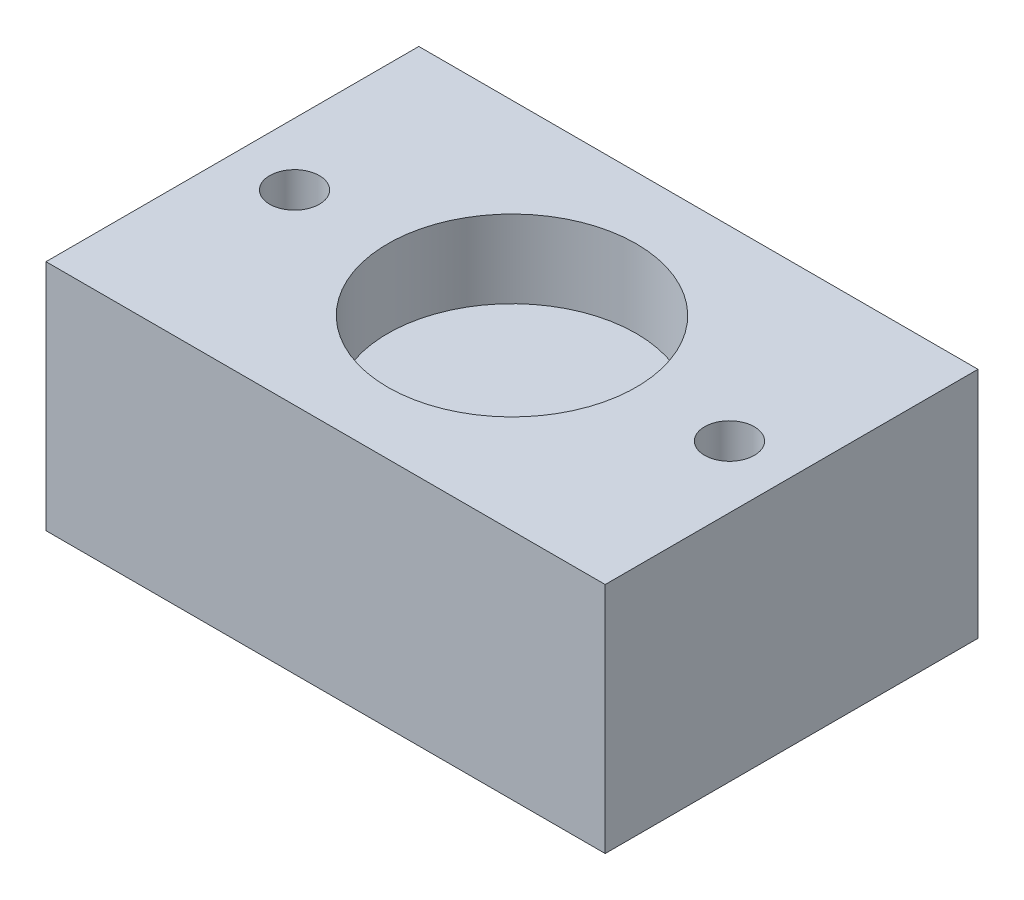
ISO-10303-21;
HEADER;
FILE_DESCRIPTION(('STEP AP214'),'2;1');
FILE_NAME('part.step','',(''),(''),'','','');
FILE_SCHEMA(('AUTOMOTIVE_DESIGN { 1 0 10303 214 1 1 1 1 }'));
ENDSEC;
DATA;
#1=APPLICATION_CONTEXT('core data for automotive mechanical design processes');
#2=APPLICATION_PROTOCOL_DEFINITION('international standard','automotive_design',2000,#1);
#3=PRODUCT_CONTEXT('',#1,'mechanical');
#4=PRODUCT('Part','Part','',(#3));
#5=PRODUCT_RELATED_PRODUCT_CATEGORY('part','',(#4));
#6=PRODUCT_DEFINITION_FORMATION('','',#4);
#7=PRODUCT_DEFINITION_CONTEXT('part definition',#1,'design');
#8=PRODUCT_DEFINITION('design','',#6,#7);
#9=PRODUCT_DEFINITION_SHAPE('','',#8);
#10=(LENGTH_UNIT() NAMED_UNIT(*) SI_UNIT(.MILLI.,.METRE.));
#11=(NAMED_UNIT(*) PLANE_ANGLE_UNIT() SI_UNIT($,.RADIAN.));
#12=(NAMED_UNIT(*) SI_UNIT($,.STERADIAN.) SOLID_ANGLE_UNIT());
#13=UNCERTAINTY_MEASURE_WITH_UNIT(LENGTH_MEASURE(1.E-05),#10,'distance_accuracy_value','');
#14=(GEOMETRIC_REPRESENTATION_CONTEXT(3) GLOBAL_UNCERTAINTY_ASSIGNED_CONTEXT((#13)) GLOBAL_UNIT_ASSIGNED_CONTEXT((#10,
#11,#12)) REPRESENTATION_CONTEXT('',''));
#15=CARTESIAN_POINT('',(0.,0.,0.));
#16=DIRECTION('',(0.,0.,1.));
#17=DIRECTION('',(1.,0.,0.));
#18=AXIS2_PLACEMENT_3D('',#15,#16,#17);
#19=CARTESIAN_POINT('',(0.,15.,0.));
#20=DIRECTION('',(1.,0.,0.));
#21=DIRECTION('',(0.,0.,-1.));
#22=AXIS2_PLACEMENT_3D('',#19,#20,#21);
#23=PLANE('',#22);
#24=DIRECTION('',(0.,0.,1.));
#25=VECTOR('',#24,1.);
#26=CARTESIAN_POINT('',(0.,0.,0.));
#27=LINE('',#26,#25);
#28=CARTESIAN_POINT('',(0.,0.,-24.));
#29=VERTEX_POINT('',#28);
#30=CARTESIAN_POINT('',(0.,0.,0.));
#31=VERTEX_POINT('',#30);
#32=EDGE_CURVE('E110',#29,#31,#27,.T.);
#33=ORIENTED_EDGE('',*,*,#32,.T.);
#34=DIRECTION('',(0.,-1.,0.));
#35=VECTOR('',#34,1.);
#36=CARTESIAN_POINT('',(0.,15.,0.));
#37=LINE('',#36,#35);
#38=CARTESIAN_POINT('',(0.,15.,0.));
#39=VERTEX_POINT('',#38);
#40=EDGE_CURVE('E11',#39,#31,#37,.T.);
#41=ORIENTED_EDGE('',*,*,#40,.F.);
#42=DIRECTION('',(0.,0.,1.));
#43=VECTOR('',#42,1.);
#44=CARTESIAN_POINT('',(0.,15.,0.));
#45=LINE('',#44,#43);
#46=CARTESIAN_POINT('',(0.,15.,-24.));
#47=VERTEX_POINT('',#46);
#48=EDGE_CURVE('E94',#47,#39,#45,.T.);
#49=ORIENTED_EDGE('',*,*,#48,.F.);
#50=DIRECTION('',(0.,-1.,0.));
#51=VECTOR('',#50,1.);
#52=CARTESIAN_POINT('',(0.,15.,-24.));
#53=LINE('',#52,#51);
#54=EDGE_CURVE('E106',#47,#29,#53,.T.);
#55=ORIENTED_EDGE('',*,*,#54,.T.);
#56=EDGE_LOOP('',(#33,#41,#49,#55));
#57=FACE_BOUND('',#56,.T.);
#58=ADVANCED_FACE('F42',(#57),#23,.F.);
#59=CARTESIAN_POINT('',(0.,15.,0.));
#60=DIRECTION('',(0.,0.,-1.));
#61=DIRECTION('',(-1.,0.,0.));
#62=AXIS2_PLACEMENT_3D('',#59,#60,#61);
#63=PLANE('',#62);
#64=DIRECTION('',(1.,0.,0.));
#65=VECTOR('',#64,1.);
#66=CARTESIAN_POINT('',(0.,0.,0.));
#67=LINE('',#66,#65);
#68=CARTESIAN_POINT('',(36.,0.,0.));
#69=VERTEX_POINT('',#68);
#70=EDGE_CURVE('E99',#31,#69,#67,.T.);
#71=ORIENTED_EDGE('',*,*,#70,.T.);
#72=DIRECTION('',(0.,-1.,0.));
#73=VECTOR('',#72,1.);
#74=CARTESIAN_POINT('',(36.,15.,0.));
#75=LINE('',#74,#73);
#76=CARTESIAN_POINT('',(36.,15.,0.));
#77=VERTEX_POINT('',#76);
#78=EDGE_CURVE('E51',#77,#69,#75,.T.);
#79=ORIENTED_EDGE('',*,*,#78,.F.);
#80=DIRECTION('',(1.,0.,0.));
#81=VECTOR('',#80,1.);
#82=CARTESIAN_POINT('',(0.,15.,0.));
#83=LINE('',#82,#81);
#84=EDGE_CURVE('E89',#39,#77,#83,.T.);
#85=ORIENTED_EDGE('',*,*,#84,.F.);
#86=ORIENTED_EDGE('',*,*,#40,.T.);
#87=EDGE_LOOP('',(#71,#79,#85,#86));
#88=FACE_BOUND('',#87,.T.);
#89=ADVANCED_FACE('F98',(#88),#63,.F.);
#90=CARTESIAN_POINT('',(36.,15.,0.));
#91=DIRECTION('',(-1.,0.,0.));
#92=DIRECTION('',(0.,0.,1.));
#93=AXIS2_PLACEMENT_3D('',#90,#91,#92);
#94=PLANE('',#93);
#95=DIRECTION('',(0.,0.,-1.));
#96=VECTOR('',#95,1.);
#97=CARTESIAN_POINT('',(36.,0.,0.));
#98=LINE('',#97,#96);
#99=CARTESIAN_POINT('',(36.,0.,-24.));
#100=VERTEX_POINT('',#99);
#101=EDGE_CURVE('E76',#69,#100,#98,.T.);
#102=ORIENTED_EDGE('',*,*,#101,.T.);
#103=DIRECTION('',(0.,-1.,0.));
#104=VECTOR('',#103,1.);
#105=CARTESIAN_POINT('',(36.,15.,-24.));
#106=LINE('',#105,#104);
#107=CARTESIAN_POINT('',(36.,15.,-24.));
#108=VERTEX_POINT('',#107);
#109=EDGE_CURVE('E101',#108,#100,#106,.T.);
#110=ORIENTED_EDGE('',*,*,#109,.F.);
#111=DIRECTION('',(0.,0.,-1.));
#112=VECTOR('',#111,1.);
#113=CARTESIAN_POINT('',(36.,15.,0.));
#114=LINE('',#113,#112);
#115=EDGE_CURVE('E92',#77,#108,#114,.T.);
#116=ORIENTED_EDGE('',*,*,#115,.F.);
#117=ORIENTED_EDGE('',*,*,#78,.T.);
#118=EDGE_LOOP('',(#102,#110,#116,#117));
#119=FACE_BOUND('',#118,.T.);
#120=ADVANCED_FACE('F102',(#119),#94,.F.);
#121=CARTESIAN_POINT('',(0.,15.,-24.));
#122=DIRECTION('',(0.,0.,1.));
#123=DIRECTION('',(1.,0.,0.));
#124=AXIS2_PLACEMENT_3D('',#121,#122,#123);
#125=PLANE('',#124);
#126=DIRECTION('',(-1.,0.,0.));
#127=VECTOR('',#126,1.);
#128=CARTESIAN_POINT('',(0.,0.,-24.));
#129=LINE('',#128,#127);
#130=EDGE_CURVE('E82',#100,#29,#129,.T.);
#131=ORIENTED_EDGE('',*,*,#130,.T.);
#132=ORIENTED_EDGE('',*,*,#54,.F.);
#133=DIRECTION('',(-1.,0.,0.));
#134=VECTOR('',#133,1.);
#135=CARTESIAN_POINT('',(0.,15.,-24.));
#136=LINE('',#135,#134);
#137=EDGE_CURVE('E59',#108,#47,#136,.T.);
#138=ORIENTED_EDGE('',*,*,#137,.F.);
#139=ORIENTED_EDGE('',*,*,#109,.T.);
#140=EDGE_LOOP('',(#131,#132,#138,#139));
#141=FACE_BOUND('',#140,.T.);
#142=ADVANCED_FACE('F124',(#141),#125,.F.);
#143=CARTESIAN_POINT('',(0.,15.,0.));
#144=DIRECTION('',(0.,-1.,0.));
#145=DIRECTION('',(0.,0.,-1.));
#146=AXIS2_PLACEMENT_3D('',#143,#144,#145);
#147=PLANE('',#146);
#148=CARTESIAN_POINT('',(4.,15.,-12.));
#149=DIRECTION('',(0.,1.,0.));
#150=DIRECTION('',(0.,0.,1.));
#151=AXIS2_PLACEMENT_3D('',#148,#149,#150);
#152=CIRCLE('',#151,1.59999999999999);
#153=CARTESIAN_POINT('',(4.,15.,-10.4));
#154=VERTEX_POINT('',#153);
#155=EDGE_CURVE('E150',#154,#154,#152,.T.);
#156=ORIENTED_EDGE('',*,*,#155,.F.);
#157=EDGE_LOOP('',(#156));
#158=FACE_BOUND('',#157,.T.);
#159=CARTESIAN_POINT('',(32.,15.,-12.));
#160=DIRECTION('',(0.,1.,0.));
#161=DIRECTION('',(0.,0.,1.));
#162=AXIS2_PLACEMENT_3D('',#159,#160,#161);
#163=CIRCLE('',#162,1.59999999999999);
#164=CARTESIAN_POINT('',(32.,15.,-10.4));
#165=VERTEX_POINT('',#164);
#166=EDGE_CURVE('E142',#165,#165,#163,.T.);
#167=ORIENTED_EDGE('',*,*,#166,.F.);
#168=EDGE_LOOP('',(#167));
#169=FACE_BOUND('',#168,.T.);
#170=CARTESIAN_POINT('',(18.,15.,-12.));
#171=DIRECTION('',(0.,1.,0.));
#172=DIRECTION('',(0.,0.,1.));
#173=AXIS2_PLACEMENT_3D('',#170,#171,#172);
#174=CIRCLE('',#173,8.);
#175=CARTESIAN_POINT('',(18.,15.,-4.));
#176=VERTEX_POINT('',#175);
#177=EDGE_CURVE('E131',#176,#176,#174,.T.);
#178=ORIENTED_EDGE('',*,*,#177,.F.);
#179=EDGE_LOOP('',(#178));
#180=FACE_BOUND('',#179,.T.);
#181=ORIENTED_EDGE('',*,*,#48,.T.);
#182=ORIENTED_EDGE('',*,*,#84,.T.);
#183=ORIENTED_EDGE('',*,*,#115,.T.);
#184=ORIENTED_EDGE('',*,*,#137,.T.);
#185=EDGE_LOOP('',(#181,#182,#183,#184));
#186=FACE_BOUND('',#185,.T.);
#187=ADVANCED_FACE('F90',(#158,#169,#180,#186),#147,.F.);
#188=CARTESIAN_POINT('',(0.,0.,0.));
#189=DIRECTION('',(0.,-1.,0.));
#190=DIRECTION('',(0.,0.,-1.));
#191=AXIS2_PLACEMENT_3D('',#188,#189,#190);
#192=PLANE('',#191);
#193=CARTESIAN_POINT('',(4.,0.,-12.));
#194=DIRECTION('',(0.,1.,0.));
#195=DIRECTION('',(0.,0.,1.));
#196=AXIS2_PLACEMENT_3D('',#193,#194,#195);
#197=CIRCLE('',#196,1.6);
#198=CARTESIAN_POINT('',(4.,0.,-10.4));
#199=VERTEX_POINT('',#198);
#200=EDGE_CURVE('E146',#199,#199,#197,.T.);
#201=ORIENTED_EDGE('',*,*,#200,.T.);
#202=EDGE_LOOP('',(#201));
#203=FACE_BOUND('',#202,.T.);
#204=CARTESIAN_POINT('',(32.,0.,-12.));
#205=DIRECTION('',(0.,1.,0.));
#206=DIRECTION('',(0.,0.,1.));
#207=AXIS2_PLACEMENT_3D('',#204,#205,#206);
#208=CIRCLE('',#207,1.6);
#209=CARTESIAN_POINT('',(32.,0.,-10.4));
#210=VERTEX_POINT('',#209);
#211=EDGE_CURVE('E135',#210,#210,#208,.T.);
#212=ORIENTED_EDGE('',*,*,#211,.T.);
#213=EDGE_LOOP('',(#212));
#214=FACE_BOUND('',#213,.T.);
#215=ORIENTED_EDGE('',*,*,#32,.F.);
#216=ORIENTED_EDGE('',*,*,#130,.F.);
#217=ORIENTED_EDGE('',*,*,#101,.F.);
#218=ORIENTED_EDGE('',*,*,#70,.F.);
#219=EDGE_LOOP('',(#215,#216,#217,#218));
#220=FACE_BOUND('',#219,.T.);
#221=ADVANCED_FACE('F127',(#203,#214,#220),#192,.T.);
#222=CARTESIAN_POINT('',(18.,10.,-12.));
#223=DIRECTION('',(0.,1.,0.));
#224=DIRECTION('',(0.,0.,1.));
#225=AXIS2_PLACEMENT_3D('',#222,#223,#224);
#226=CYLINDRICAL_SURFACE('',#225,8.);
#227=CARTESIAN_POINT('',(18.,10.,-12.));
#228=DIRECTION('',(0.,1.,0.));
#229=DIRECTION('',(0.,0.,1.));
#230=AXIS2_PLACEMENT_3D('',#227,#228,#229);
#231=CIRCLE('',#230,8.);
#232=CARTESIAN_POINT('',(18.,10.,-4.));
#233=VERTEX_POINT('',#232);
#234=EDGE_CURVE('E114',#233,#233,#231,.T.);
#235=ORIENTED_EDGE('',*,*,#234,.F.);
#236=EDGE_LOOP('',(#235));
#237=FACE_BOUND('',#236,.T.);
#238=ORIENTED_EDGE('',*,*,#177,.T.);
#239=EDGE_LOOP('',(#238));
#240=FACE_BOUND('',#239,.T.);
#241=ADVANCED_FACE('F164',(#237,#240),#226,.F.);
#242=CARTESIAN_POINT('',(18.,10.,-12.));
#243=DIRECTION('',(0.,1.,0.));
#244=DIRECTION('',(0.,0.,1.));
#245=AXIS2_PLACEMENT_3D('',#242,#243,#244);
#246=PLANE('',#245);
#247=ORIENTED_EDGE('',*,*,#234,.T.);
#248=EDGE_LOOP('',(#247));
#249=FACE_BOUND('',#248,.T.);
#250=ADVANCED_FACE('F166',(#249),#246,.T.);
#251=CARTESIAN_POINT('',(32.,15.,-12.));
#252=DIRECTION('',(0.,1.,0.));
#253=DIRECTION('',(0.,0.,1.));
#254=AXIS2_PLACEMENT_3D('',#251,#252,#253);
#255=CYLINDRICAL_SURFACE('',#254,1.59999999999999);
#256=ORIENTED_EDGE('',*,*,#211,.F.);
#257=EDGE_LOOP('',(#256));
#258=FACE_BOUND('',#257,.T.);
#259=ORIENTED_EDGE('',*,*,#166,.T.);
#260=EDGE_LOOP('',(#259));
#261=FACE_BOUND('',#260,.T.);
#262=ADVANCED_FACE('F173',(#258,#261),#255,.F.);
#263=CARTESIAN_POINT('',(4.,15.,-12.));
#264=DIRECTION('',(0.,1.,0.));
#265=DIRECTION('',(0.,0.,1.));
#266=AXIS2_PLACEMENT_3D('',#263,#264,#265);
#267=CYLINDRICAL_SURFACE('',#266,1.59999999999999);
#268=ORIENTED_EDGE('',*,*,#200,.F.);
#269=EDGE_LOOP('',(#268));
#270=FACE_BOUND('',#269,.T.);
#271=ORIENTED_EDGE('',*,*,#155,.T.);
#272=EDGE_LOOP('',(#271));
#273=FACE_BOUND('',#272,.T.);
#274=ADVANCED_FACE('F155',(#270,#273),#267,.F.);
#275=CLOSED_SHELL('',(#58,#89,#120,#142,#187,#221,#241,#250,#262,#274));
#276=MANIFOLD_SOLID_BREP('B2',#275);
#277=ADVANCED_BREP_SHAPE_REPRESENTATION('',(#18,#276),#14);
#278=SHAPE_DEFINITION_REPRESENTATION(#9,#277);
ENDSEC;
END-ISO-10303-21;
